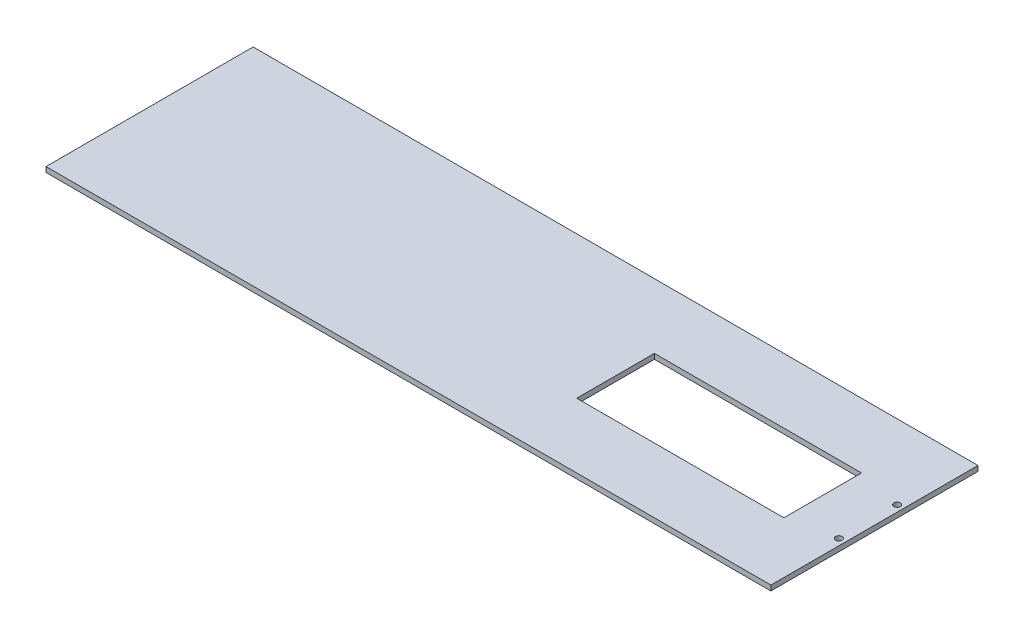
ISO-10303-21;
HEADER;
FILE_DESCRIPTION(('STEP AP214'),'2;1');
FILE_NAME('part.step','',(''),(''),'','','');
FILE_SCHEMA(('AUTOMOTIVE_DESIGN { 1 0 10303 214 1 1 1 1 }'));
ENDSEC;
DATA;
#1=APPLICATION_CONTEXT('core data for automotive mechanical design processes');
#2=APPLICATION_PROTOCOL_DEFINITION('international standard','automotive_design',2000,#1);
#3=PRODUCT_CONTEXT('',#1,'mechanical');
#4=PRODUCT('Part','Part','',(#3));
#5=PRODUCT_RELATED_PRODUCT_CATEGORY('part','',(#4));
#6=PRODUCT_DEFINITION_FORMATION('','',#4);
#7=PRODUCT_DEFINITION_CONTEXT('part definition',#1,'design');
#8=PRODUCT_DEFINITION('design','',#6,#7);
#9=PRODUCT_DEFINITION_SHAPE('','',#8);
#10=(LENGTH_UNIT() NAMED_UNIT(*) SI_UNIT(.MILLI.,.METRE.));
#11=(NAMED_UNIT(*) PLANE_ANGLE_UNIT() SI_UNIT($,.RADIAN.));
#12=(NAMED_UNIT(*) SI_UNIT($,.STERADIAN.) SOLID_ANGLE_UNIT());
#13=UNCERTAINTY_MEASURE_WITH_UNIT(LENGTH_MEASURE(1.E-05),#10,'distance_accuracy_value','');
#14=(GEOMETRIC_REPRESENTATION_CONTEXT(3) GLOBAL_UNCERTAINTY_ASSIGNED_CONTEXT((#13)) GLOBAL_UNIT_ASSIGNED_CONTEXT((#10,
#11,#12)) REPRESENTATION_CONTEXT('',''));
#15=CARTESIAN_POINT('',(0.,0.,0.));
#16=DIRECTION('',(0.,0.,1.));
#17=DIRECTION('',(1.,0.,0.));
#18=AXIS2_PLACEMENT_3D('',#15,#16,#17);
#19=CARTESIAN_POINT('',(177.8,2.54,50.8));
#20=DIRECTION('',(-1.,0.,0.));
#21=DIRECTION('',(0.,0.,1.));
#22=AXIS2_PLACEMENT_3D('',#19,#20,#21);
#23=PLANE('',#22);
#24=DIRECTION('',(0.,0.,-1.));
#25=VECTOR('',#24,1.);
#26=CARTESIAN_POINT('',(177.8,0.,50.8));
#27=LINE('',#26,#25);
#28=CARTESIAN_POINT('',(177.8,0.,50.8));
#29=VERTEX_POINT('',#28);
#30=CARTESIAN_POINT('',(177.8,0.,-50.8));
#31=VERTEX_POINT('',#30);
#32=EDGE_CURVE('E153',#29,#31,#27,.T.);
#33=ORIENTED_EDGE('',*,*,#32,.T.);
#34=DIRECTION('',(0.,-1.,0.));
#35=VECTOR('',#34,1.);
#36=CARTESIAN_POINT('',(177.8,2.54,-50.8));
#37=LINE('',#36,#35);
#38=CARTESIAN_POINT('',(177.8,2.54,-50.8));
#39=VERTEX_POINT('',#38);
#40=EDGE_CURVE('E12',#39,#31,#37,.T.);
#41=ORIENTED_EDGE('',*,*,#40,.F.);
#42=DIRECTION('',(0.,0.,-1.));
#43=VECTOR('',#42,1.);
#44=CARTESIAN_POINT('',(177.8,2.54,50.8));
#45=LINE('',#44,#43);
#46=CARTESIAN_POINT('',(177.8,2.54,50.8));
#47=VERTEX_POINT('',#46);
#48=EDGE_CURVE('E157',#47,#39,#45,.T.);
#49=ORIENTED_EDGE('',*,*,#48,.F.);
#50=DIRECTION('',(0.,-1.,0.));
#51=VECTOR('',#50,1.);
#52=CARTESIAN_POINT('',(177.8,2.54,50.8));
#53=LINE('',#52,#51);
#54=EDGE_CURVE('E174',#47,#29,#53,.T.);
#55=ORIENTED_EDGE('',*,*,#54,.T.);
#56=EDGE_LOOP('',(#33,#41,#49,#55));
#57=FACE_BOUND('',#56,.T.);
#58=ADVANCED_FACE('F40',(#57),#23,.F.);
#59=CARTESIAN_POINT('',(-177.8,2.54,-50.8));
#60=DIRECTION('',(0.,0.,1.));
#61=DIRECTION('',(1.,0.,0.));
#62=AXIS2_PLACEMENT_3D('',#59,#60,#61);
#63=PLANE('',#62);
#64=DIRECTION('',(-1.,0.,0.));
#65=VECTOR('',#64,1.);
#66=CARTESIAN_POINT('',(-177.8,0.,-50.8));
#67=LINE('',#66,#65);
#68=CARTESIAN_POINT('',(-177.8,0.,-50.8));
#69=VERTEX_POINT('',#68);
#70=EDGE_CURVE('E177',#31,#69,#67,.T.);
#71=ORIENTED_EDGE('',*,*,#70,.T.);
#72=DIRECTION('',(0.,-1.,0.));
#73=VECTOR('',#72,1.);
#74=CARTESIAN_POINT('',(-177.8,2.54,-50.8));
#75=LINE('',#74,#73);
#76=CARTESIAN_POINT('',(-177.8,2.54,-50.8));
#77=VERTEX_POINT('',#76);
#78=EDGE_CURVE('E47',#77,#69,#75,.T.);
#79=ORIENTED_EDGE('',*,*,#78,.F.);
#80=DIRECTION('',(-1.,0.,0.));
#81=VECTOR('',#80,1.);
#82=CARTESIAN_POINT('',(-177.8,2.54,-50.8));
#83=LINE('',#82,#81);
#84=EDGE_CURVE('E162',#39,#77,#83,.T.);
#85=ORIENTED_EDGE('',*,*,#84,.F.);
#86=ORIENTED_EDGE('',*,*,#40,.T.);
#87=EDGE_LOOP('',(#71,#79,#85,#86));
#88=FACE_BOUND('',#87,.T.);
#89=ADVANCED_FACE('F251',(#88),#63,.F.);
#90=CARTESIAN_POINT('',(-177.8,2.54,50.8));
#91=DIRECTION('',(1.,0.,0.));
#92=DIRECTION('',(0.,0.,-1.));
#93=AXIS2_PLACEMENT_3D('',#90,#91,#92);
#94=PLANE('',#93);
#95=DIRECTION('',(0.,0.,1.));
#96=VECTOR('',#95,1.);
#97=CARTESIAN_POINT('',(-177.8,0.,50.8));
#98=LINE('',#97,#96);
#99=CARTESIAN_POINT('',(-177.8,0.,50.8));
#100=VERTEX_POINT('',#99);
#101=EDGE_CURVE('E179',#69,#100,#98,.T.);
#102=ORIENTED_EDGE('',*,*,#101,.T.);
#103=DIRECTION('',(0.,-1.,0.));
#104=VECTOR('',#103,1.);
#105=CARTESIAN_POINT('',(-177.8,2.54,50.8));
#106=LINE('',#105,#104);
#107=CARTESIAN_POINT('',(-177.8,2.54,50.8));
#108=VERTEX_POINT('',#107);
#109=EDGE_CURVE('E184',#108,#100,#106,.T.);
#110=ORIENTED_EDGE('',*,*,#109,.F.);
#111=DIRECTION('',(0.,0.,1.));
#112=VECTOR('',#111,1.);
#113=CARTESIAN_POINT('',(-177.8,2.54,50.8));
#114=LINE('',#113,#112);
#115=EDGE_CURVE('E167',#77,#108,#114,.T.);
#116=ORIENTED_EDGE('',*,*,#115,.F.);
#117=ORIENTED_EDGE('',*,*,#78,.T.);
#118=EDGE_LOOP('',(#102,#110,#116,#117));
#119=FACE_BOUND('',#118,.T.);
#120=ADVANCED_FACE('F191',(#119),#94,.F.);
#121=CARTESIAN_POINT('',(-177.8,2.54,50.8));
#122=DIRECTION('',(0.,0.,-1.));
#123=DIRECTION('',(-1.,0.,0.));
#124=AXIS2_PLACEMENT_3D('',#121,#122,#123);
#125=PLANE('',#124);
#126=DIRECTION('',(1.,0.,0.));
#127=VECTOR('',#126,1.);
#128=CARTESIAN_POINT('',(-177.8,0.,50.8));
#129=LINE('',#128,#127);
#130=EDGE_CURVE('E163',#100,#29,#129,.T.);
#131=ORIENTED_EDGE('',*,*,#130,.T.);
#132=ORIENTED_EDGE('',*,*,#54,.F.);
#133=DIRECTION('',(1.,0.,0.));
#134=VECTOR('',#133,1.);
#135=CARTESIAN_POINT('',(-177.8,2.54,50.8));
#136=LINE('',#135,#134);
#137=EDGE_CURVE('E170',#108,#47,#136,.T.);
#138=ORIENTED_EDGE('',*,*,#137,.F.);
#139=ORIENTED_EDGE('',*,*,#109,.T.);
#140=EDGE_LOOP('',(#131,#132,#138,#139));
#141=FACE_BOUND('',#140,.T.);
#142=ADVANCED_FACE('F198',(#141),#125,.F.);
#143=CARTESIAN_POINT('',(0.,2.54,0.));
#144=DIRECTION('',(0.,-1.,0.));
#145=DIRECTION('',(0.,0.,-1.));
#146=AXIS2_PLACEMENT_3D('',#143,#144,#145);
#147=PLANE('',#146);
#148=CARTESIAN_POINT('',(174.625,2.54,-14.2875));
#149=DIRECTION('',(0.,1.,0.));
#150=DIRECTION('',(0.,0.,1.));
#151=AXIS2_PLACEMENT_3D('',#148,#149,#150);
#152=CIRCLE('',#151,1.58749999999998);
#153=CARTESIAN_POINT('',(174.625,2.54,-12.7));
#154=VERTEX_POINT('',#153);
#155=EDGE_CURVE('E213',#154,#154,#152,.T.);
#156=ORIENTED_EDGE('',*,*,#155,.F.);
#157=EDGE_LOOP('',(#156));
#158=FACE_BOUND('',#157,.T.);
#159=CARTESIAN_POINT('',(174.625,2.54,14.2875));
#160=DIRECTION('',(0.,1.,0.));
#161=DIRECTION('',(0.,0.,1.));
#162=AXIS2_PLACEMENT_3D('',#159,#160,#161);
#163=CIRCLE('',#162,1.58749999999998);
#164=CARTESIAN_POINT('',(174.625,2.54,15.875));
#165=VERTEX_POINT('',#164);
#166=EDGE_CURVE('E129',#165,#165,#163,.T.);
#167=ORIENTED_EDGE('',*,*,#166,.F.);
#168=EDGE_LOOP('',(#167));
#169=FACE_BOUND('',#168,.T.);
#170=DIRECTION('',(1.,0.,0.));
#171=VECTOR('',#170,1.);
#172=CARTESIAN_POINT('',(152.4,2.54,19.05));
#173=LINE('',#172,#171);
#174=CARTESIAN_POINT('',(50.8,2.54,19.05));
#175=VERTEX_POINT('',#174);
#176=CARTESIAN_POINT('',(152.4,2.54,19.05));
#177=VERTEX_POINT('',#176);
#178=EDGE_CURVE('E138',#175,#177,#173,.T.);
#179=ORIENTED_EDGE('',*,*,#178,.F.);
#180=DIRECTION('',(0.,0.,1.));
#181=VECTOR('',#180,1.);
#182=CARTESIAN_POINT('',(50.8,2.54,19.05));
#183=LINE('',#182,#181);
#184=CARTESIAN_POINT('',(50.8,2.54,-19.05));
#185=VERTEX_POINT('',#184);
#186=EDGE_CURVE('E54',#185,#175,#183,.T.);
#187=ORIENTED_EDGE('',*,*,#186,.F.);
#188=DIRECTION('',(-1.,0.,0.));
#189=VECTOR('',#188,1.);
#190=CARTESIAN_POINT('',(152.4,2.54,-19.05));
#191=LINE('',#190,#189);
#192=CARTESIAN_POINT('',(152.4,2.54,-19.05));
#193=VERTEX_POINT('',#192);
#194=EDGE_CURVE('E122',#193,#185,#191,.T.);
#195=ORIENTED_EDGE('',*,*,#194,.F.);
#196=DIRECTION('',(0.,0.,-1.));
#197=VECTOR('',#196,1.);
#198=CARTESIAN_POINT('',(152.4,2.54,19.05));
#199=LINE('',#198,#197);
#200=EDGE_CURVE('E126',#177,#193,#199,.T.);
#201=ORIENTED_EDGE('',*,*,#200,.F.);
#202=EDGE_LOOP('',(#179,#187,#195,#201));
#203=FACE_BOUND('',#202,.T.);
#204=ORIENTED_EDGE('',*,*,#48,.T.);
#205=ORIENTED_EDGE('',*,*,#84,.T.);
#206=ORIENTED_EDGE('',*,*,#115,.T.);
#207=ORIENTED_EDGE('',*,*,#137,.T.);
#208=EDGE_LOOP('',(#204,#205,#206,#207));
#209=FACE_BOUND('',#208,.T.);
#210=ADVANCED_FACE('F204',(#158,#169,#203,#209),#147,.F.);
#211=CARTESIAN_POINT('',(0.,0.,0.));
#212=DIRECTION('',(0.,-1.,0.));
#213=DIRECTION('',(0.,0.,-1.));
#214=AXIS2_PLACEMENT_3D('',#211,#212,#213);
#215=PLANE('',#214);
#216=CARTESIAN_POINT('',(174.625,0.,-14.2875));
#217=DIRECTION('',(0.,1.,0.));
#218=DIRECTION('',(0.,0.,1.));
#219=AXIS2_PLACEMENT_3D('',#216,#217,#218);
#220=CIRCLE('',#219,1.58749999999998);
#221=CARTESIAN_POINT('',(174.625,0.,-12.7));
#222=VERTEX_POINT('',#221);
#223=EDGE_CURVE('E139',#222,#222,#220,.T.);
#224=ORIENTED_EDGE('',*,*,#223,.T.);
#225=EDGE_LOOP('',(#224));
#226=FACE_BOUND('',#225,.T.);
#227=CARTESIAN_POINT('',(174.625,0.,14.2875));
#228=DIRECTION('',(0.,1.,0.));
#229=DIRECTION('',(0.,0.,1.));
#230=AXIS2_PLACEMENT_3D('',#227,#228,#229);
#231=CIRCLE('',#230,1.58749999999998);
#232=CARTESIAN_POINT('',(174.625,0.,15.875));
#233=VERTEX_POINT('',#232);
#234=EDGE_CURVE('E212',#233,#233,#231,.T.);
#235=ORIENTED_EDGE('',*,*,#234,.T.);
#236=EDGE_LOOP('',(#235));
#237=FACE_BOUND('',#236,.T.);
#238=DIRECTION('',(0.,0.,1.));
#239=VECTOR('',#238,1.);
#240=CARTESIAN_POINT('',(50.8,0.,19.05));
#241=LINE('',#240,#239);
#242=CARTESIAN_POINT('',(50.8,0.,-19.05));
#243=VERTEX_POINT('',#242);
#244=CARTESIAN_POINT('',(50.8,0.,19.05));
#245=VERTEX_POINT('',#244);
#246=EDGE_CURVE('E106',#243,#245,#241,.T.);
#247=ORIENTED_EDGE('',*,*,#246,.T.);
#248=DIRECTION('',(1.,0.,0.));
#249=VECTOR('',#248,1.);
#250=CARTESIAN_POINT('',(152.4,0.,19.05));
#251=LINE('',#250,#249);
#252=CARTESIAN_POINT('',(152.4,0.,19.05));
#253=VERTEX_POINT('',#252);
#254=EDGE_CURVE('E115',#245,#253,#251,.T.);
#255=ORIENTED_EDGE('',*,*,#254,.T.);
#256=DIRECTION('',(0.,0.,-1.));
#257=VECTOR('',#256,1.);
#258=CARTESIAN_POINT('',(152.4,0.,19.05));
#259=LINE('',#258,#257);
#260=CARTESIAN_POINT('',(152.4,0.,-19.05));
#261=VERTEX_POINT('',#260);
#262=EDGE_CURVE('E62',#253,#261,#259,.T.);
#263=ORIENTED_EDGE('',*,*,#262,.T.);
#264=DIRECTION('',(-1.,0.,0.));
#265=VECTOR('',#264,1.);
#266=CARTESIAN_POINT('',(152.4,0.,-19.05));
#267=LINE('',#266,#265);
#268=EDGE_CURVE('E112',#261,#243,#267,.T.);
#269=ORIENTED_EDGE('',*,*,#268,.T.);
#270=EDGE_LOOP('',(#247,#255,#263,#269));
#271=FACE_BOUND('',#270,.T.);
#272=ORIENTED_EDGE('',*,*,#32,.F.);
#273=ORIENTED_EDGE('',*,*,#130,.F.);
#274=ORIENTED_EDGE('',*,*,#101,.F.);
#275=ORIENTED_EDGE('',*,*,#70,.F.);
#276=EDGE_LOOP('',(#272,#273,#274,#275));
#277=FACE_BOUND('',#276,.T.);
#278=ADVANCED_FACE('F119',(#226,#237,#271,#277),#215,.T.);
#279=CARTESIAN_POINT('',(50.8,0.,19.05));
#280=DIRECTION('',(-1.,0.,0.));
#281=DIRECTION('',(0.,0.,1.));
#282=AXIS2_PLACEMENT_3D('',#279,#280,#281);
#283=PLANE('',#282);
#284=ORIENTED_EDGE('',*,*,#186,.T.);
#285=DIRECTION('',(0.,1.,0.));
#286=VECTOR('',#285,1.);
#287=CARTESIAN_POINT('',(50.8,0.,19.05));
#288=LINE('',#287,#286);
#289=EDGE_CURVE('E102',#245,#175,#288,.T.);
#290=ORIENTED_EDGE('',*,*,#289,.F.);
#291=ORIENTED_EDGE('',*,*,#246,.F.);
#292=DIRECTION('',(0.,1.,0.));
#293=VECTOR('',#292,1.);
#294=CARTESIAN_POINT('',(50.8,0.,-19.05));
#295=LINE('',#294,#293);
#296=EDGE_CURVE('E151',#243,#185,#295,.T.);
#297=ORIENTED_EDGE('',*,*,#296,.T.);
#298=EDGE_LOOP('',(#284,#290,#291,#297));
#299=FACE_BOUND('',#298,.T.);
#300=ADVANCED_FACE('F104',(#299),#283,.F.);
#301=CARTESIAN_POINT('',(152.4,0.,-19.05));
#302=DIRECTION('',(0.,0.,-1.));
#303=DIRECTION('',(-1.,0.,0.));
#304=AXIS2_PLACEMENT_3D('',#301,#302,#303);
#305=PLANE('',#304);
#306=ORIENTED_EDGE('',*,*,#194,.T.);
#307=ORIENTED_EDGE('',*,*,#296,.F.);
#308=ORIENTED_EDGE('',*,*,#268,.F.);
#309=DIRECTION('',(0.,1.,0.));
#310=VECTOR('',#309,1.);
#311=CARTESIAN_POINT('',(152.4,0.,-19.05));
#312=LINE('',#311,#310);
#313=EDGE_CURVE('E154',#261,#193,#312,.T.);
#314=ORIENTED_EDGE('',*,*,#313,.T.);
#315=EDGE_LOOP('',(#306,#307,#308,#314));
#316=FACE_BOUND('',#315,.T.);
#317=ADVANCED_FACE('F241',(#316),#305,.F.);
#318=CARTESIAN_POINT('',(152.4,0.,19.05));
#319=DIRECTION('',(1.,0.,0.));
#320=DIRECTION('',(0.,0.,-1.));
#321=AXIS2_PLACEMENT_3D('',#318,#319,#320);
#322=PLANE('',#321);
#323=ORIENTED_EDGE('',*,*,#200,.T.);
#324=ORIENTED_EDGE('',*,*,#313,.F.);
#325=ORIENTED_EDGE('',*,*,#262,.F.);
#326=DIRECTION('',(0.,1.,0.));
#327=VECTOR('',#326,1.);
#328=CARTESIAN_POINT('',(152.4,0.,19.05));
#329=LINE('',#328,#327);
#330=EDGE_CURVE('E111',#253,#177,#329,.T.);
#331=ORIENTED_EDGE('',*,*,#330,.T.);
#332=EDGE_LOOP('',(#323,#324,#325,#331));
#333=FACE_BOUND('',#332,.T.);
#334=ADVANCED_FACE('F239',(#333),#322,.F.);
#335=CARTESIAN_POINT('',(152.4,0.,19.05));
#336=DIRECTION('',(0.,0.,1.));
#337=DIRECTION('',(1.,0.,0.));
#338=AXIS2_PLACEMENT_3D('',#335,#336,#337);
#339=PLANE('',#338);
#340=ORIENTED_EDGE('',*,*,#178,.T.);
#341=ORIENTED_EDGE('',*,*,#330,.F.);
#342=ORIENTED_EDGE('',*,*,#254,.F.);
#343=ORIENTED_EDGE('',*,*,#289,.T.);
#344=EDGE_LOOP('',(#340,#341,#342,#343));
#345=FACE_BOUND('',#344,.T.);
#346=ADVANCED_FACE('F116',(#345),#339,.F.);
#347=CARTESIAN_POINT('',(174.625,0.,14.2875));
#348=DIRECTION('',(0.,1.,0.));
#349=DIRECTION('',(0.,0.,1.));
#350=AXIS2_PLACEMENT_3D('',#347,#348,#349);
#351=CYLINDRICAL_SURFACE('',#350,1.58749999999998);
#352=ORIENTED_EDGE('',*,*,#234,.F.);
#353=EDGE_LOOP('',(#352));
#354=FACE_BOUND('',#353,.T.);
#355=ORIENTED_EDGE('',*,*,#166,.T.);
#356=EDGE_LOOP('',(#355));
#357=FACE_BOUND('',#356,.T.);
#358=ADVANCED_FACE('F226',(#354,#357),#351,.F.);
#359=CARTESIAN_POINT('',(174.625,0.,-14.2875));
#360=DIRECTION('',(0.,1.,0.));
#361=DIRECTION('',(0.,0.,1.));
#362=AXIS2_PLACEMENT_3D('',#359,#360,#361);
#363=CYLINDRICAL_SURFACE('',#362,1.58749999999998);
#364=ORIENTED_EDGE('',*,*,#223,.F.);
#365=EDGE_LOOP('',(#364));
#366=FACE_BOUND('',#365,.T.);
#367=ORIENTED_EDGE('',*,*,#155,.T.);
#368=EDGE_LOOP('',(#367));
#369=FACE_BOUND('',#368,.T.);
#370=ADVANCED_FACE('F229',(#366,#369),#363,.F.);
#371=CLOSED_SHELL('',(#58,#89,#120,#142,#210,#278,#300,#317,#334,#346,#358,#370));
#372=MANIFOLD_SOLID_BREP('B2',#371);
#373=ADVANCED_BREP_SHAPE_REPRESENTATION('',(#18,#372),#14);
#374=SHAPE_DEFINITION_REPRESENTATION(#9,#373);
ENDSEC;
END-ISO-10303-21;
